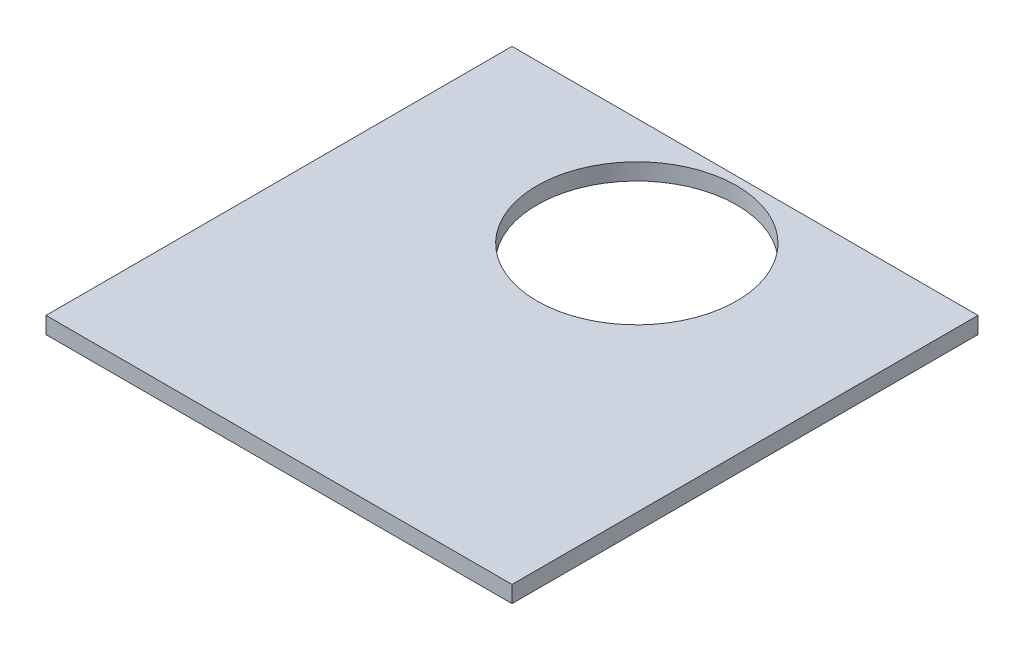
ISO-10303-21;
HEADER;
FILE_DESCRIPTION(('STEP AP214'),'2;1');
FILE_NAME('part.step','',(''),(''),'','','');
FILE_SCHEMA(('AUTOMOTIVE_DESIGN { 1 0 10303 214 1 1 1 1 }'));
ENDSEC;
DATA;
#1=APPLICATION_CONTEXT('core data for automotive mechanical design processes');
#2=APPLICATION_PROTOCOL_DEFINITION('international standard','automotive_design',2000,#1);
#3=PRODUCT_CONTEXT('',#1,'mechanical');
#4=PRODUCT('Part','Part','',(#3));
#5=PRODUCT_RELATED_PRODUCT_CATEGORY('part','',(#4));
#6=PRODUCT_DEFINITION_FORMATION('','',#4);
#7=PRODUCT_DEFINITION_CONTEXT('part definition',#1,'design');
#8=PRODUCT_DEFINITION('design','',#6,#7);
#9=PRODUCT_DEFINITION_SHAPE('','',#8);
#10=(LENGTH_UNIT() NAMED_UNIT(*) SI_UNIT(.MILLI.,.METRE.));
#11=(NAMED_UNIT(*) PLANE_ANGLE_UNIT() SI_UNIT($,.RADIAN.));
#12=(NAMED_UNIT(*) SI_UNIT($,.STERADIAN.) SOLID_ANGLE_UNIT());
#13=UNCERTAINTY_MEASURE_WITH_UNIT(LENGTH_MEASURE(1.E-05),#10,'distance_accuracy_value','');
#14=(GEOMETRIC_REPRESENTATION_CONTEXT(3) GLOBAL_UNCERTAINTY_ASSIGNED_CONTEXT((#13)) GLOBAL_UNIT_ASSIGNED_CONTEXT((#10,
#11,#12)) REPRESENTATION_CONTEXT('',''));
#15=CARTESIAN_POINT('',(0.,0.,0.));
#16=DIRECTION('',(0.,0.,1.));
#17=DIRECTION('',(1.,0.,0.));
#18=AXIS2_PLACEMENT_3D('',#15,#16,#17);
#19=CARTESIAN_POINT('',(45.7068504945369,-2.54,30.903644768989));
#20=DIRECTION('',(1.,0.,0.));
#21=DIRECTION('',(0.,0.,-1.));
#22=AXIS2_PLACEMENT_3D('',#19,#20,#21);
#23=PLANE('',#22);
#24=DIRECTION('',(0.,0.,-1.));
#25=VECTOR('',#24,1.);
#26=CARTESIAN_POINT('',(45.7068504945369,0.,30.903644768989));
#27=LINE('',#26,#25);
#28=CARTESIAN_POINT('',(45.7068504945369,0.,30.903644768989));
#29=VERTEX_POINT('',#28);
#30=CARTESIAN_POINT('',(45.7068504945369,0.,-40.2163552310109));
#31=VERTEX_POINT('',#30);
#32=EDGE_CURVE('E98',#29,#31,#27,.T.);
#33=ORIENTED_EDGE('',*,*,#32,.F.);
#34=DIRECTION('',(0.,1.,0.));
#35=VECTOR('',#34,1.);
#36=CARTESIAN_POINT('',(45.7068504945369,-2.54,30.903644768989));
#37=LINE('',#36,#35);
#38=CARTESIAN_POINT('',(45.7068504945369,-2.54,30.903644768989));
#39=VERTEX_POINT('',#38);
#40=EDGE_CURVE('E11',#39,#29,#37,.T.);
#41=ORIENTED_EDGE('',*,*,#40,.F.);
#42=DIRECTION('',(0.,0.,-1.));
#43=VECTOR('',#42,1.);
#44=CARTESIAN_POINT('',(45.7068504945369,-2.54,30.903644768989));
#45=LINE('',#44,#43);
#46=CARTESIAN_POINT('',(45.7068504945369,-2.54,-40.2163552310109));
#47=VERTEX_POINT('',#46);
#48=EDGE_CURVE('E91',#39,#47,#45,.T.);
#49=ORIENTED_EDGE('',*,*,#48,.T.);
#50=DIRECTION('',(0.,1.,0.));
#51=VECTOR('',#50,1.);
#52=CARTESIAN_POINT('',(45.7068504945369,-2.54,-40.2163552310109));
#53=LINE('',#52,#51);
#54=EDGE_CURVE('E36',#47,#31,#53,.T.);
#55=ORIENTED_EDGE('',*,*,#54,.T.);
#56=EDGE_LOOP('',(#33,#41,#49,#55));
#57=FACE_BOUND('',#56,.T.);
#58=ADVANCED_FACE('F33',(#57),#23,.T.);
#59=CARTESIAN_POINT('',(-25.4131495054631,-2.54,30.903644768989));
#60=DIRECTION('',(0.,0.,1.));
#61=DIRECTION('',(1.,0.,0.));
#62=AXIS2_PLACEMENT_3D('',#59,#60,#61);
#63=PLANE('',#62);
#64=DIRECTION('',(1.,0.,0.));
#65=VECTOR('',#64,1.);
#66=CARTESIAN_POINT('',(-25.4131495054631,0.,30.903644768989));
#67=LINE('',#66,#65);
#68=CARTESIAN_POINT('',(-25.4131495054631,0.,30.903644768989));
#69=VERTEX_POINT('',#68);
#70=EDGE_CURVE('E93',#69,#29,#67,.T.);
#71=ORIENTED_EDGE('',*,*,#70,.F.);
#72=DIRECTION('',(0.,1.,0.));
#73=VECTOR('',#72,1.);
#74=CARTESIAN_POINT('',(-25.4131495054631,-2.54,30.903644768989));
#75=LINE('',#74,#73);
#76=CARTESIAN_POINT('',(-25.4131495054631,-2.54,30.903644768989));
#77=VERTEX_POINT('',#76);
#78=EDGE_CURVE('E42',#77,#69,#75,.T.);
#79=ORIENTED_EDGE('',*,*,#78,.F.);
#80=DIRECTION('',(1.,0.,0.));
#81=VECTOR('',#80,1.);
#82=CARTESIAN_POINT('',(-25.4131495054631,-2.54,30.903644768989));
#83=LINE('',#82,#81);
#84=EDGE_CURVE('E88',#77,#39,#83,.T.);
#85=ORIENTED_EDGE('',*,*,#84,.T.);
#86=ORIENTED_EDGE('',*,*,#40,.T.);
#87=EDGE_LOOP('',(#71,#79,#85,#86));
#88=FACE_BOUND('',#87,.T.);
#89=ADVANCED_FACE('F109',(#88),#63,.T.);
#90=CARTESIAN_POINT('',(-25.4131495054631,-2.54,30.903644768989));
#91=DIRECTION('',(-1.,0.,0.));
#92=DIRECTION('',(0.,0.,1.));
#93=AXIS2_PLACEMENT_3D('',#90,#91,#92);
#94=PLANE('',#93);
#95=DIRECTION('',(0.,0.,1.));
#96=VECTOR('',#95,1.);
#97=CARTESIAN_POINT('',(-25.4131495054631,0.,30.903644768989));
#98=LINE('',#97,#96);
#99=CARTESIAN_POINT('',(-25.4131495054631,0.,-40.2163552310109));
#100=VERTEX_POINT('',#99);
#101=EDGE_CURVE('E83',#100,#69,#98,.T.);
#102=ORIENTED_EDGE('',*,*,#101,.F.);
#103=DIRECTION('',(0.,1.,0.));
#104=VECTOR('',#103,1.);
#105=CARTESIAN_POINT('',(-25.4131495054631,-2.54,-40.2163552310109));
#106=LINE('',#105,#104);
#107=CARTESIAN_POINT('',(-25.4131495054631,-2.54,-40.2163552310109));
#108=VERTEX_POINT('',#107);
#109=EDGE_CURVE('E78',#108,#100,#106,.T.);
#110=ORIENTED_EDGE('',*,*,#109,.F.);
#111=DIRECTION('',(0.,0.,1.));
#112=VECTOR('',#111,1.);
#113=CARTESIAN_POINT('',(-25.4131495054631,-2.54,30.903644768989));
#114=LINE('',#113,#112);
#115=EDGE_CURVE('E81',#108,#77,#114,.T.);
#116=ORIENTED_EDGE('',*,*,#115,.T.);
#117=ORIENTED_EDGE('',*,*,#78,.T.);
#118=EDGE_LOOP('',(#102,#110,#116,#117));
#119=FACE_BOUND('',#118,.T.);
#120=ADVANCED_FACE('F80',(#119),#94,.T.);
#121=CARTESIAN_POINT('',(-25.4131495054631,-2.54,-40.2163552310109));
#122=DIRECTION('',(0.,0.,-1.));
#123=DIRECTION('',(-1.,0.,0.));
#124=AXIS2_PLACEMENT_3D('',#121,#122,#123);
#125=PLANE('',#124);
#126=DIRECTION('',(-1.,0.,0.));
#127=VECTOR('',#126,1.);
#128=CARTESIAN_POINT('',(-25.4131495054631,0.,-40.2163552310109));
#129=LINE('',#128,#127);
#130=EDGE_CURVE('E101',#31,#100,#129,.T.);
#131=ORIENTED_EDGE('',*,*,#130,.F.);
#132=ORIENTED_EDGE('',*,*,#54,.F.);
#133=DIRECTION('',(-1.,0.,0.));
#134=VECTOR('',#133,1.);
#135=CARTESIAN_POINT('',(-25.4131495054631,-2.54,-40.2163552310109));
#136=LINE('',#135,#134);
#137=EDGE_CURVE('E87',#47,#108,#136,.T.);
#138=ORIENTED_EDGE('',*,*,#137,.T.);
#139=ORIENTED_EDGE('',*,*,#109,.T.);
#140=EDGE_LOOP('',(#131,#132,#138,#139));
#141=FACE_BOUND('',#140,.T.);
#142=ADVANCED_FACE('F90',(#141),#125,.T.);
#143=CARTESIAN_POINT('',(0.,-2.54,0.));
#144=DIRECTION('',(0.,-1.,0.));
#145=DIRECTION('',(0.,0.,-1.));
#146=AXIS2_PLACEMENT_3D('',#143,#144,#145);
#147=PLANE('',#146);
#148=CARTESIAN_POINT('',(10.1468504945369,-2.54,-23.7063552310109));
#149=DIRECTION('',(0.,-1.,0.));
#150=DIRECTION('',(0.,0.,-1.));
#151=AXIS2_PLACEMENT_3D('',#148,#149,#150);
#152=CIRCLE('',#151,15.24);
#153=CARTESIAN_POINT('',(10.1468504945369,-2.54,-38.9463552310109));
#154=VERTEX_POINT('',#153);
#155=EDGE_CURVE('E102',#154,#154,#152,.T.);
#156=ORIENTED_EDGE('',*,*,#155,.F.);
#157=EDGE_LOOP('',(#156));
#158=FACE_BOUND('',#157,.T.);
#159=ORIENTED_EDGE('',*,*,#48,.F.);
#160=ORIENTED_EDGE('',*,*,#84,.F.);
#161=ORIENTED_EDGE('',*,*,#115,.F.);
#162=ORIENTED_EDGE('',*,*,#137,.F.);
#163=EDGE_LOOP('',(#159,#160,#161,#162));
#164=FACE_BOUND('',#163,.T.);
#165=ADVANCED_FACE('F86',(#158,#164),#147,.T.);
#166=CARTESIAN_POINT('',(0.,0.,0.));
#167=DIRECTION('',(0.,-1.,0.));
#168=DIRECTION('',(0.,0.,-1.));
#169=AXIS2_PLACEMENT_3D('',#166,#167,#168);
#170=PLANE('',#169);
#171=CARTESIAN_POINT('',(10.1468504945369,0.,-23.7063552310109));
#172=DIRECTION('',(0.,1.,0.));
#173=DIRECTION('',(0.,0.,1.));
#174=AXIS2_PLACEMENT_3D('',#171,#172,#173);
#175=CIRCLE('',#174,15.24);
#176=CARTESIAN_POINT('',(10.1468504945369,0.,-8.46635523101094));
#177=VERTEX_POINT('',#176);
#178=EDGE_CURVE('E139',#177,#177,#175,.T.);
#179=ORIENTED_EDGE('',*,*,#178,.F.);
#180=EDGE_LOOP('',(#179));
#181=FACE_BOUND('',#180,.T.);
#182=ORIENTED_EDGE('',*,*,#32,.T.);
#183=ORIENTED_EDGE('',*,*,#130,.T.);
#184=ORIENTED_EDGE('',*,*,#101,.T.);
#185=ORIENTED_EDGE('',*,*,#70,.T.);
#186=EDGE_LOOP('',(#182,#183,#184,#185));
#187=FACE_BOUND('',#186,.T.);
#188=ADVANCED_FACE('F108',(#181,#187),#170,.F.);
#189=CARTESIAN_POINT('',(10.1468504945369,-15.748,-23.7063552310109));
#190=DIRECTION('',(0.,1.,0.));
#191=DIRECTION('',(0.,0.,1.));
#192=AXIS2_PLACEMENT_3D('',#189,#190,#191);
#193=CYLINDRICAL_SURFACE('',#192,15.24);
#194=ORIENTED_EDGE('',*,*,#155,.T.);
#195=EDGE_LOOP('',(#194));
#196=FACE_BOUND('',#195,.T.);
#197=ORIENTED_EDGE('',*,*,#178,.T.);
#198=EDGE_LOOP('',(#197));
#199=FACE_BOUND('',#198,.T.);
#200=ADVANCED_FACE('F127',(#196,#199),#193,.F.);
#201=CLOSED_SHELL('',(#58,#89,#120,#142,#165,#188,#200));
#202=MANIFOLD_SOLID_BREP('B2',#201);
#203=ADVANCED_BREP_SHAPE_REPRESENTATION('',(#18,#202),#14);
#204=SHAPE_DEFINITION_REPRESENTATION(#9,#203);
ENDSEC;
END-ISO-10303-21;
